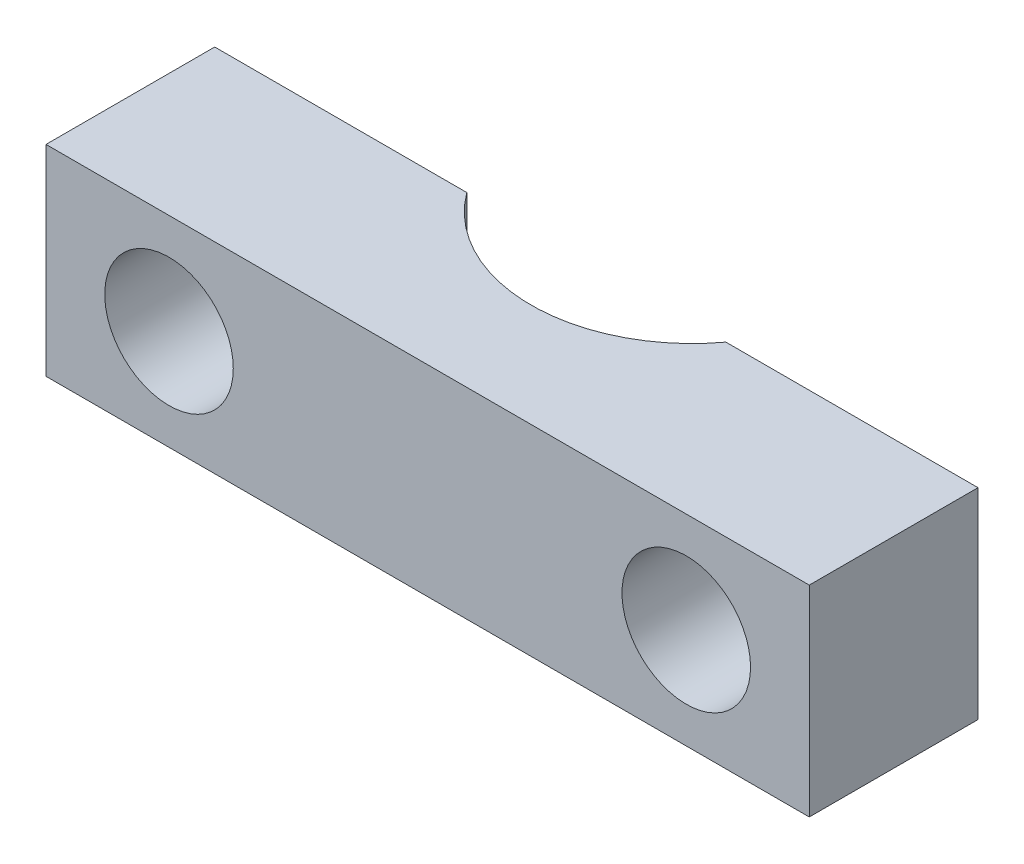
ISO-10303-21;
HEADER;
FILE_DESCRIPTION(('STEP AP214'),'2;1');
FILE_NAME('part.step','',(''),(''),'','','');
FILE_SCHEMA(('AUTOMOTIVE_DESIGN { 1 0 10303 214 1 1 1 1 }'));
ENDSEC;
DATA;
#1=APPLICATION_CONTEXT('core data for automotive mechanical design processes');
#2=APPLICATION_PROTOCOL_DEFINITION('international standard','automotive_design',2000,#1);
#3=PRODUCT_CONTEXT('',#1,'mechanical');
#4=PRODUCT('Part','Part','',(#3));
#5=PRODUCT_RELATED_PRODUCT_CATEGORY('part','',(#4));
#6=PRODUCT_DEFINITION_FORMATION('','',#4);
#7=PRODUCT_DEFINITION_CONTEXT('part definition',#1,'design');
#8=PRODUCT_DEFINITION('design','',#6,#7);
#9=PRODUCT_DEFINITION_SHAPE('','',#8);
#10=(LENGTH_UNIT() NAMED_UNIT(*) SI_UNIT(.MILLI.,.METRE.));
#11=(NAMED_UNIT(*) PLANE_ANGLE_UNIT() SI_UNIT($,.RADIAN.));
#12=(NAMED_UNIT(*) SI_UNIT($,.STERADIAN.) SOLID_ANGLE_UNIT());
#13=UNCERTAINTY_MEASURE_WITH_UNIT(LENGTH_MEASURE(1.E-05),#10,'distance_accuracy_value','');
#14=(GEOMETRIC_REPRESENTATION_CONTEXT(3) GLOBAL_UNCERTAINTY_ASSIGNED_CONTEXT((#13)) GLOBAL_UNIT_ASSIGNED_CONTEXT((#10,
#11,#12)) REPRESENTATION_CONTEXT('',''));
#15=CARTESIAN_POINT('',(0.,0.,0.));
#16=DIRECTION('',(0.,0.,1.));
#17=DIRECTION('',(1.,0.,0.));
#18=AXIS2_PLACEMENT_3D('',#15,#16,#17);
#19=CARTESIAN_POINT('',(0.,0.,0.));
#20=DIRECTION('',(0.,0.,-1.));
#21=DIRECTION('',(-1.,0.,0.));
#22=AXIS2_PLACEMENT_3D('',#19,#20,#21);
#23=PLANE('',#22);
#24=DIRECTION('',(0.,-1.,0.));
#25=VECTOR('',#24,1.);
#26=CARTESIAN_POINT('',(29.0076482248737,-25.9096920216637,0.));
#27=LINE('',#26,#25);
#28=CARTESIAN_POINT('',(29.0076482248737,-28.1096920216637,0.));
#29=VERTEX_POINT('',#28);
#30=CARTESIAN_POINT('',(29.0076482248737,-33.1096920216637,0.));
#31=VERTEX_POINT('',#30);
#32=EDGE_CURVE('E92',#29,#31,#27,.T.);
#33=ORIENTED_EDGE('',*,*,#32,.F.);
#34=DIRECTION('',(-1.,0.,0.));
#35=VECTOR('',#34,1.);
#36=CARTESIAN_POINT('',(16.2830278271809,-28.1096920216637,0.));
#37=LINE('',#36,#35);
#38=CARTESIAN_POINT('',(35.2830278271809,-28.1096920216637,0.));
#39=VERTEX_POINT('',#38);
#40=EDGE_CURVE('E119',#39,#29,#37,.T.);
#41=ORIENTED_EDGE('',*,*,#40,.F.);
#42=DIRECTION('',(0.,1.,0.));
#43=VECTOR('',#42,1.);
#44=CARTESIAN_POINT('',(35.2830278271809,-33.1096920216637,0.));
#45=LINE('',#44,#43);
#46=CARTESIAN_POINT('',(35.2830278271809,-33.1096920216637,0.));
#47=VERTEX_POINT('',#46);
#48=EDGE_CURVE('E110',#47,#39,#45,.T.);
#49=ORIENTED_EDGE('',*,*,#48,.F.);
#50=DIRECTION('',(1.,0.,0.));
#51=VECTOR('',#50,1.);
#52=CARTESIAN_POINT('',(16.2830278271809,-33.1096920216637,0.));
#53=LINE('',#52,#51);
#54=EDGE_CURVE('E104',#31,#47,#53,.T.);
#55=ORIENTED_EDGE('',*,*,#54,.F.);
#56=EDGE_LOOP('',(#33,#41,#49,#55));
#57=FACE_BOUND('',#56,.T.);
#58=CARTESIAN_POINT('',(32.2209465642684,-30.6096920216637,0.));
#59=DIRECTION('',(0.,0.,1.));
#60=DIRECTION('',(1.,0.,0.));
#61=AXIS2_PLACEMENT_3D('',#58,#59,#60);
#62=CIRCLE('',#61,1.6);
#63=CARTESIAN_POINT('',(33.8209465642684,-30.6096920216637,0.));
#64=VERTEX_POINT('',#63);
#65=EDGE_CURVE('E100',#64,#64,#62,.T.);
#66=ORIENTED_EDGE('',*,*,#65,.T.);
#67=EDGE_LOOP('',(#66));
#68=FACE_BOUND('',#67,.T.);
#69=ADVANCED_FACE('F33',(#57,#68),#23,.T.);
#70=CARTESIAN_POINT('',(0.,0.,4.2));
#71=DIRECTION('',(0.,0.,-1.));
#72=DIRECTION('',(-1.,0.,0.));
#73=AXIS2_PLACEMENT_3D('',#70,#71,#72);
#74=PLANE('',#73);
#75=DIRECTION('',(0.,-1.,0.));
#76=VECTOR('',#75,1.);
#77=CARTESIAN_POINT('',(16.2830278271809,-33.1096920216637,4.2));
#78=LINE('',#77,#76);
#79=CARTESIAN_POINT('',(16.2830278271809,-28.1096920216637,4.2));
#80=VERTEX_POINT('',#79);
#81=CARTESIAN_POINT('',(16.2830278271809,-33.1096920216637,4.2));
#82=VERTEX_POINT('',#81);
#83=EDGE_CURVE('E121',#80,#82,#78,.T.);
#84=ORIENTED_EDGE('',*,*,#83,.T.);
#85=DIRECTION('',(1.,0.,0.));
#86=VECTOR('',#85,1.);
#87=CARTESIAN_POINT('',(16.2830278271809,-33.1096920216637,4.2));
#88=LINE('',#87,#86);
#89=CARTESIAN_POINT('',(35.2830278271809,-33.1096920216637,4.2));
#90=VERTEX_POINT('',#89);
#91=EDGE_CURVE('E84',#82,#90,#88,.T.);
#92=ORIENTED_EDGE('',*,*,#91,.T.);
#93=DIRECTION('',(0.,1.,0.));
#94=VECTOR('',#93,1.);
#95=CARTESIAN_POINT('',(35.2830278271809,-33.1096920216637,4.2));
#96=LINE('',#95,#94);
#97=CARTESIAN_POINT('',(35.2830278271809,-28.1096920216637,4.2));
#98=VERTEX_POINT('',#97);
#99=EDGE_CURVE('E149',#90,#98,#96,.T.);
#100=ORIENTED_EDGE('',*,*,#99,.T.);
#101=DIRECTION('',(-1.,0.,0.));
#102=VECTOR('',#101,1.);
#103=CARTESIAN_POINT('',(16.2830278271809,-28.1096920216637,4.2));
#104=LINE('',#103,#102);
#105=EDGE_CURVE('E56',#98,#80,#104,.T.);
#106=ORIENTED_EDGE('',*,*,#105,.T.);
#107=EDGE_LOOP('',(#84,#92,#100,#106));
#108=FACE_BOUND('',#107,.T.);
#109=CARTESIAN_POINT('',(19.3451090900934,-30.6096920216637,4.2));
#110=DIRECTION('',(0.,0.,1.));
#111=DIRECTION('',(1.,0.,0.));
#112=AXIS2_PLACEMENT_3D('',#109,#110,#111);
#113=CIRCLE('',#112,1.6);
#114=CARTESIAN_POINT('',(20.9451090900934,-30.6096920216637,4.2));
#115=VERTEX_POINT('',#114);
#116=EDGE_CURVE('E114',#115,#115,#113,.T.);
#117=ORIENTED_EDGE('',*,*,#116,.F.);
#118=EDGE_LOOP('',(#117));
#119=FACE_BOUND('',#118,.T.);
#120=CARTESIAN_POINT('',(32.2209465642684,-30.6096920216637,4.2));
#121=DIRECTION('',(0.,0.,1.));
#122=DIRECTION('',(1.,0.,0.));
#123=AXIS2_PLACEMENT_3D('',#120,#121,#122);
#124=CIRCLE('',#123,1.6);
#125=CARTESIAN_POINT('',(33.8209465642684,-30.6096920216637,4.2));
#126=VERTEX_POINT('',#125);
#127=EDGE_CURVE('E137',#126,#126,#124,.T.);
#128=ORIENTED_EDGE('',*,*,#127,.F.);
#129=EDGE_LOOP('',(#128));
#130=FACE_BOUND('',#129,.T.);
#131=ADVANCED_FACE('F152',(#108,#119,#130),#74,.F.);
#132=DIRECTION('',(0.,-1.,0.));
#133=VECTOR('',#132,1.);
#134=CARTESIAN_POINT('',(22.5584074294882,-25.9096920216637,0.));
#135=LINE('',#134,#133);
#136=CARTESIAN_POINT('',(22.5584074294882,-33.1096920216637,0.));
#137=VERTEX_POINT('',#136);
#138=CARTESIAN_POINT('',(22.5584074294882,-28.1096920216637,0.));
#139=VERTEX_POINT('',#138);
#140=EDGE_CURVE('E48',#137,#139,#135,.F.);
#141=ORIENTED_EDGE('',*,*,#140,.F.);
#142=CARTESIAN_POINT('',(16.2830278271809,-33.1096920216637,0.));
#143=VERTEX_POINT('',#142);
#144=EDGE_CURVE('E106',#143,#137,#53,.T.);
#145=ORIENTED_EDGE('',*,*,#144,.F.);
#146=DIRECTION('',(0.,-1.,0.));
#147=VECTOR('',#146,1.);
#148=CARTESIAN_POINT('',(16.2830278271809,-33.1096920216637,0.));
#149=LINE('',#148,#147);
#150=CARTESIAN_POINT('',(16.2830278271809,-28.1096920216637,0.));
#151=VERTEX_POINT('',#150);
#152=EDGE_CURVE('E111',#151,#143,#149,.T.);
#153=ORIENTED_EDGE('',*,*,#152,.F.);
#154=EDGE_CURVE('E76',#139,#151,#37,.T.);
#155=ORIENTED_EDGE('',*,*,#154,.F.);
#156=EDGE_LOOP('',(#141,#145,#153,#155));
#157=FACE_BOUND('',#156,.T.);
#158=CARTESIAN_POINT('',(19.3451090900934,-30.6096920216637,0.));
#159=DIRECTION('',(0.,0.,1.));
#160=DIRECTION('',(1.,0.,0.));
#161=AXIS2_PLACEMENT_3D('',#158,#159,#160);
#162=CIRCLE('',#161,1.6);
#163=CARTESIAN_POINT('',(20.9451090900934,-30.6096920216637,0.));
#164=VERTEX_POINT('',#163);
#165=EDGE_CURVE('E140',#164,#164,#162,.T.);
#166=ORIENTED_EDGE('',*,*,#165,.T.);
#167=EDGE_LOOP('',(#166));
#168=FACE_BOUND('',#167,.T.);
#169=ADVANCED_FACE('F133',(#157,#168),#23,.T.);
#170=CARTESIAN_POINT('',(16.2830278271809,-33.1096920216637,4.2));
#171=DIRECTION('',(1.,0.,0.));
#172=DIRECTION('',(0.,0.,-1.));
#173=AXIS2_PLACEMENT_3D('',#170,#171,#172);
#174=PLANE('',#173);
#175=ORIENTED_EDGE('',*,*,#152,.T.);
#176=DIRECTION('',(0.,0.,-1.));
#177=VECTOR('',#176,1.);
#178=CARTESIAN_POINT('',(16.2830278271809,-33.1096920216637,4.2));
#179=LINE('',#178,#177);
#180=EDGE_CURVE('E41',#82,#143,#179,.T.);
#181=ORIENTED_EDGE('',*,*,#180,.F.);
#182=ORIENTED_EDGE('',*,*,#83,.F.);
#183=DIRECTION('',(0.,0.,-1.));
#184=VECTOR('',#183,1.);
#185=CARTESIAN_POINT('',(16.2830278271809,-28.1096920216637,4.2));
#186=LINE('',#185,#184);
#187=EDGE_CURVE('E122',#80,#151,#186,.T.);
#188=ORIENTED_EDGE('',*,*,#187,.T.);
#189=EDGE_LOOP('',(#175,#181,#182,#188));
#190=FACE_BOUND('',#189,.T.);
#191=ADVANCED_FACE('F35',(#190),#174,.F.);
#192=CARTESIAN_POINT('',(16.2830278271809,-33.1096920216637,4.2));
#193=DIRECTION('',(0.,1.,0.));
#194=DIRECTION('',(0.,0.,1.));
#195=AXIS2_PLACEMENT_3D('',#192,#193,#194);
#196=PLANE('',#195);
#197=ORIENTED_EDGE('',*,*,#144,.T.);
#198=CARTESIAN_POINT('',(25.7830278271809,-33.1096920216637,-2.3831655637173));
#199=DIRECTION('',(0.,-1.,0.));
#200=DIRECTION('',(0.,0.,-1.));
#201=AXIS2_PLACEMENT_3D('',#198,#199,#200);
#202=CIRCLE('',#201,4.00969510228696);
#203=EDGE_CURVE('E95',#31,#137,#202,.T.);
#204=ORIENTED_EDGE('',*,*,#203,.F.);
#205=ORIENTED_EDGE('',*,*,#54,.T.);
#206=DIRECTION('',(0.,0.,-1.));
#207=VECTOR('',#206,1.);
#208=CARTESIAN_POINT('',(35.2830278271809,-33.1096920216637,4.2));
#209=LINE('',#208,#207);
#210=EDGE_CURVE('E127',#90,#47,#209,.T.);
#211=ORIENTED_EDGE('',*,*,#210,.F.);
#212=ORIENTED_EDGE('',*,*,#91,.F.);
#213=ORIENTED_EDGE('',*,*,#180,.T.);
#214=EDGE_LOOP('',(#197,#204,#205,#211,#212,#213));
#215=FACE_BOUND('',#214,.T.);
#216=ADVANCED_FACE('F103',(#215),#196,.F.);
#217=CARTESIAN_POINT('',(35.2830278271809,-33.1096920216637,4.2));
#218=DIRECTION('',(-1.,0.,0.));
#219=DIRECTION('',(0.,0.,1.));
#220=AXIS2_PLACEMENT_3D('',#217,#218,#219);
#221=PLANE('',#220);
#222=ORIENTED_EDGE('',*,*,#48,.T.);
#223=DIRECTION('',(0.,0.,-1.));
#224=VECTOR('',#223,1.);
#225=CARTESIAN_POINT('',(35.2830278271809,-28.1096920216637,4.2));
#226=LINE('',#225,#224);
#227=EDGE_CURVE('E124',#98,#39,#226,.T.);
#228=ORIENTED_EDGE('',*,*,#227,.F.);
#229=ORIENTED_EDGE('',*,*,#99,.F.);
#230=ORIENTED_EDGE('',*,*,#210,.T.);
#231=EDGE_LOOP('',(#222,#228,#229,#230));
#232=FACE_BOUND('',#231,.T.);
#233=ADVANCED_FACE('F155',(#232),#221,.F.);
#234=CARTESIAN_POINT('',(16.2830278271809,-28.1096920216637,4.2));
#235=DIRECTION('',(0.,-1.,0.));
#236=DIRECTION('',(0.,0.,-1.));
#237=AXIS2_PLACEMENT_3D('',#234,#235,#236);
#238=PLANE('',#237);
#239=ORIENTED_EDGE('',*,*,#40,.T.);
#240=CARTESIAN_POINT('',(25.7830278271809,-28.1096920216637,-2.3831655637173));
#241=DIRECTION('',(0.,-1.,0.));
#242=DIRECTION('',(0.,0.,-1.));
#243=AXIS2_PLACEMENT_3D('',#240,#241,#242);
#244=CIRCLE('',#243,4.00969510228696);
#245=EDGE_CURVE('E11',#29,#139,#244,.T.);
#246=ORIENTED_EDGE('',*,*,#245,.T.);
#247=ORIENTED_EDGE('',*,*,#154,.T.);
#248=ORIENTED_EDGE('',*,*,#187,.F.);
#249=ORIENTED_EDGE('',*,*,#105,.F.);
#250=ORIENTED_EDGE('',*,*,#227,.T.);
#251=EDGE_LOOP('',(#239,#246,#247,#248,#249,#250));
#252=FACE_BOUND('',#251,.T.);
#253=ADVANCED_FACE('F156',(#252),#238,.F.);
#254=CARTESIAN_POINT('',(19.3451090900934,-30.6096920216637,4.2));
#255=DIRECTION('',(0.,0.,-1.));
#256=DIRECTION('',(-1.,0.,0.));
#257=AXIS2_PLACEMENT_3D('',#254,#255,#256);
#258=CYLINDRICAL_SURFACE('',#257,1.6);
#259=ORIENTED_EDGE('',*,*,#116,.T.);
#260=EDGE_LOOP('',(#259));
#261=FACE_BOUND('',#260,.T.);
#262=ORIENTED_EDGE('',*,*,#165,.F.);
#263=EDGE_LOOP('',(#262));
#264=FACE_BOUND('',#263,.T.);
#265=ADVANCED_FACE('F158',(#261,#264),#258,.F.);
#266=CARTESIAN_POINT('',(32.2209465642684,-30.6096920216637,4.2));
#267=DIRECTION('',(0.,0.,-1.));
#268=DIRECTION('',(-1.,0.,0.));
#269=AXIS2_PLACEMENT_3D('',#266,#267,#268);
#270=CYLINDRICAL_SURFACE('',#269,1.6);
#271=ORIENTED_EDGE('',*,*,#127,.T.);
#272=EDGE_LOOP('',(#271));
#273=FACE_BOUND('',#272,.T.);
#274=ORIENTED_EDGE('',*,*,#65,.F.);
#275=EDGE_LOOP('',(#274));
#276=FACE_BOUND('',#275,.T.);
#277=ADVANCED_FACE('F164',(#273,#276),#270,.F.);
#278=CARTESIAN_POINT('',(25.7830278271809,-25.9096920216637,-2.3831655637173));
#279=DIRECTION('',(0.,-1.,0.));
#280=DIRECTION('',(0.,0.,-1.));
#281=AXIS2_PLACEMENT_3D('',#278,#279,#280);
#282=CYLINDRICAL_SURFACE('',#281,4.00969510228696);
#283=ORIENTED_EDGE('',*,*,#32,.T.);
#284=ORIENTED_EDGE('',*,*,#203,.T.);
#285=ORIENTED_EDGE('',*,*,#140,.T.);
#286=ORIENTED_EDGE('',*,*,#245,.F.);
#287=EDGE_LOOP('',(#283,#284,#285,#286));
#288=FACE_BOUND('',#287,.T.);
#289=ADVANCED_FACE('F94',(#288),#282,.F.);
#290=CLOSED_SHELL('',(#69,#131,#169,#191,#216,#233,#253,#265,#277,#289));
#291=MANIFOLD_SOLID_BREP('B2',#290);
#292=ADVANCED_BREP_SHAPE_REPRESENTATION('',(#18,#291),#14);
#293=SHAPE_DEFINITION_REPRESENTATION(#9,#292);
ENDSEC;
END-ISO-10303-21;
